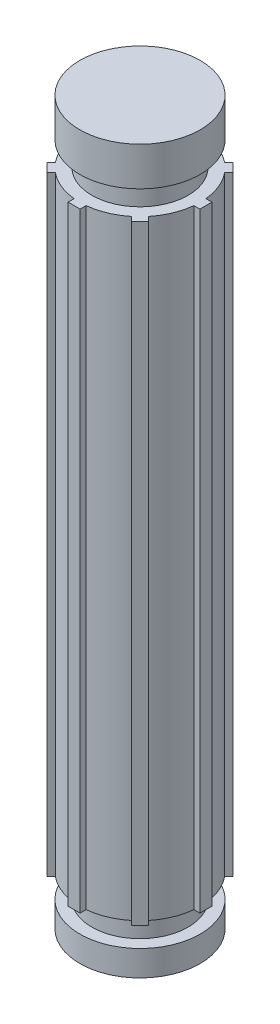
ISO-10303-21;
HEADER;
FILE_DESCRIPTION(('STEP AP214'),'2;1');
FILE_NAME('part.step','',(''),(''),'','','');
FILE_SCHEMA(('AUTOMOTIVE_DESIGN { 1 0 10303 214 1 1 1 1 }'));
ENDSEC;
DATA;
#1=APPLICATION_CONTEXT('core data for automotive mechanical design processes');
#2=APPLICATION_PROTOCOL_DEFINITION('international standard','automotive_design',2000,#1);
#3=PRODUCT_CONTEXT('',#1,'mechanical');
#4=PRODUCT('Part','Part','',(#3));
#5=PRODUCT_RELATED_PRODUCT_CATEGORY('part','',(#4));
#6=PRODUCT_DEFINITION_FORMATION('','',#4);
#7=PRODUCT_DEFINITION_CONTEXT('part definition',#1,'design');
#8=PRODUCT_DEFINITION('design','',#6,#7);
#9=PRODUCT_DEFINITION_SHAPE('','',#8);
#10=(LENGTH_UNIT() NAMED_UNIT(*) SI_UNIT(.MILLI.,.METRE.));
#11=(NAMED_UNIT(*) PLANE_ANGLE_UNIT() SI_UNIT($,.RADIAN.));
#12=(NAMED_UNIT(*) SI_UNIT($,.STERADIAN.) SOLID_ANGLE_UNIT());
#13=UNCERTAINTY_MEASURE_WITH_UNIT(LENGTH_MEASURE(1.E-05),#10,'distance_accuracy_value','');
#14=(GEOMETRIC_REPRESENTATION_CONTEXT(3) GLOBAL_UNCERTAINTY_ASSIGNED_CONTEXT((#13)) GLOBAL_UNIT_ASSIGNED_CONTEXT((#10,
#11,#12)) REPRESENTATION_CONTEXT('',''));
#15=CARTESIAN_POINT('',(0.,0.,0.));
#16=DIRECTION('',(0.,0.,1.));
#17=DIRECTION('',(1.,0.,0.));
#18=AXIS2_PLACEMENT_3D('',#15,#16,#17);
#19=CARTESIAN_POINT('',(0.,0.,0.));
#20=DIRECTION('',(0.,-1.,0.));
#21=DIRECTION('',(0.,0.,-1.));
#22=AXIS2_PLACEMENT_3D('',#19,#20,#21);
#23=CYLINDRICAL_SURFACE('',#22,10.);
#24=CARTESIAN_POINT('',(0.,109.568605078673,0.));
#25=DIRECTION('',(0.,-1.,0.));
#26=DIRECTION('',(0.,0.,-1.));
#27=AXIS2_PLACEMENT_3D('',#24,#25,#26);
#28=CIRCLE('',#27,10.);
#29=CARTESIAN_POINT('',(9.94987437106619,109.568605078673,1.0000000000001));
#30=VERTEX_POINT('',#29);
#31=CARTESIAN_POINT('',(7.74273042092162,109.568605078673,6.32851685854869));
#32=VERTEX_POINT('',#31);
#33=EDGE_CURVE('E558',#30,#32,#28,.T.);
#34=ORIENTED_EDGE('',*,*,#33,.T.);
#35=DIRECTION('',(0.,-1.,0.));
#36=VECTOR('',#35,1.);
#37=CARTESIAN_POINT('',(7.74273042092161,112.568605078673,6.32851685854869));
#38=LINE('',#37,#36);
#39=CARTESIAN_POINT('',(7.74273042092162,8.24351842560416,6.32851685854869));
#40=VERTEX_POINT('',#39);
#41=EDGE_CURVE('E66',#32,#40,#38,.T.);
#42=ORIENTED_EDGE('',*,*,#41,.T.);
#43=CARTESIAN_POINT('',(0.,8.24351842560416,0.));
#44=DIRECTION('',(0.,-1.,0.));
#45=DIRECTION('',(0.,0.,-1.));
#46=AXIS2_PLACEMENT_3D('',#43,#44,#45);
#47=CIRCLE('',#46,10.);
#48=CARTESIAN_POINT('',(9.94987437106619,8.24351842560416,1.0000000000001));
#49=VERTEX_POINT('',#48);
#50=EDGE_CURVE('E277',#49,#40,#47,.T.);
#51=ORIENTED_EDGE('',*,*,#50,.F.);
#52=DIRECTION('',(0.,-1.,0.));
#53=VECTOR('',#52,1.);
#54=CARTESIAN_POINT('',(9.94987437106619,111.804673056173,1.0000000000001));
#55=LINE('',#54,#53);
#56=EDGE_CURVE('E299',#30,#49,#55,.T.);
#57=ORIENTED_EDGE('',*,*,#56,.F.);
#58=EDGE_LOOP('',(#34,#42,#51,#57));
#59=FACE_BOUND('',#58,.T.);
#60=ADVANCED_FACE('F43',(#59),#23,.T.);
#61=CARTESIAN_POINT('',(6.3285168585485,8.24351842560416,7.74273042092177));
#62=VERTEX_POINT('',#61);
#63=CARTESIAN_POINT('',(1.,8.24351842560416,9.9498743710662));
#64=VERTEX_POINT('',#63);
#65=EDGE_CURVE('E58',#62,#64,#47,.T.);
#66=ORIENTED_EDGE('',*,*,#65,.F.);
#67=DIRECTION('',(0.,-1.,0.));
#68=VECTOR('',#67,1.);
#69=CARTESIAN_POINT('',(6.3285168585485,112.568605078673,7.74273042092177));
#70=LINE('',#69,#68);
#71=CARTESIAN_POINT('',(6.3285168585485,109.568605078673,7.74273042092177));
#72=VERTEX_POINT('',#71);
#73=EDGE_CURVE('E272',#72,#62,#70,.T.);
#74=ORIENTED_EDGE('',*,*,#73,.F.);
#75=CARTESIAN_POINT('',(1.,109.568605078673,9.9498743710662));
#76=VERTEX_POINT('',#75);
#77=EDGE_CURVE('E468',#72,#76,#28,.T.);
#78=ORIENTED_EDGE('',*,*,#77,.T.);
#79=DIRECTION('',(0.,-1.,0.));
#80=VECTOR('',#79,1.);
#81=CARTESIAN_POINT('',(1.,111.804673056173,9.9498743710662));
#82=LINE('',#81,#80);
#83=EDGE_CURVE('E460',#76,#64,#82,.T.);
#84=ORIENTED_EDGE('',*,*,#83,.T.);
#85=EDGE_LOOP('',(#66,#74,#78,#84));
#86=FACE_BOUND('',#85,.T.);
#87=ADVANCED_FACE('F519',(#86),#23,.T.);
#88=CARTESIAN_POINT('',(7.74273042092175,109.568605078673,-6.32851685854853));
#89=VERTEX_POINT('',#88);
#90=CARTESIAN_POINT('',(9.94987437106621,109.568605078673,-0.999999999999896));
#91=VERTEX_POINT('',#90);
#92=EDGE_CURVE('E559',#89,#91,#28,.T.);
#93=ORIENTED_EDGE('',*,*,#92,.T.);
#94=DIRECTION('',(0.,-1.,0.));
#95=VECTOR('',#94,1.);
#96=CARTESIAN_POINT('',(9.94987437106621,111.804673056173,-0.999999999999895));
#97=LINE('',#96,#95);
#98=CARTESIAN_POINT('',(9.94987437106621,8.24351842560416,-0.999999999999896));
#99=VERTEX_POINT('',#98);
#100=EDGE_CURVE('E310',#91,#99,#97,.T.);
#101=ORIENTED_EDGE('',*,*,#100,.T.);
#102=CARTESIAN_POINT('',(7.74273042092175,8.24351842560416,-6.32851685854853));
#103=VERTEX_POINT('',#102);
#104=EDGE_CURVE('E593',#103,#99,#47,.T.);
#105=ORIENTED_EDGE('',*,*,#104,.F.);
#106=DIRECTION('',(0.,-1.,0.));
#107=VECTOR('',#106,1.);
#108=CARTESIAN_POINT('',(7.74273042092175,112.568605078673,-6.32851685854853));
#109=LINE('',#108,#107);
#110=EDGE_CURVE('E324',#89,#103,#109,.T.);
#111=ORIENTED_EDGE('',*,*,#110,.F.);
#112=EDGE_LOOP('',(#93,#101,#105,#111));
#113=FACE_BOUND('',#112,.T.);
#114=ADVANCED_FACE('F523',(#113),#23,.T.);
#115=CARTESIAN_POINT('',(1.,109.568605078673,-9.9498743710662));
#116=VERTEX_POINT('',#115);
#117=CARTESIAN_POINT('',(6.32851685854866,109.568605078673,-7.74273042092164));
#118=VERTEX_POINT('',#117);
#119=EDGE_CURVE('E561',#116,#118,#28,.T.);
#120=ORIENTED_EDGE('',*,*,#119,.T.);
#121=DIRECTION('',(0.,-1.,0.));
#122=VECTOR('',#121,1.);
#123=CARTESIAN_POINT('',(6.32851685854866,112.568605078673,-7.74273042092164));
#124=LINE('',#123,#122);
#125=CARTESIAN_POINT('',(6.32851685854866,8.24351842560416,-7.74273042092164));
#126=VERTEX_POINT('',#125);
#127=EDGE_CURVE('E335',#118,#126,#124,.T.);
#128=ORIENTED_EDGE('',*,*,#127,.T.);
#129=CARTESIAN_POINT('',(1.,8.24351842560416,-9.9498743710662));
#130=VERTEX_POINT('',#129);
#131=EDGE_CURVE('E589',#130,#126,#47,.T.);
#132=ORIENTED_EDGE('',*,*,#131,.F.);
#133=DIRECTION('',(0.,-1.,0.));
#134=VECTOR('',#133,1.);
#135=CARTESIAN_POINT('',(1.,111.804673056173,-9.9498743710662));
#136=LINE('',#135,#134);
#137=EDGE_CURVE('E349',#116,#130,#136,.T.);
#138=ORIENTED_EDGE('',*,*,#137,.F.);
#139=EDGE_LOOP('',(#120,#128,#132,#138));
#140=FACE_BOUND('',#139,.T.);
#141=ADVANCED_FACE('F627',(#140),#23,.T.);
#142=CARTESIAN_POINT('',(-6.32851685854856,109.568605078673,-7.74273042092173));
#143=VERTEX_POINT('',#142);
#144=CARTESIAN_POINT('',(-1.,109.568605078673,-9.9498743710662));
#145=VERTEX_POINT('',#144);
#146=EDGE_CURVE('E564',#143,#145,#28,.T.);
#147=ORIENTED_EDGE('',*,*,#146,.T.);
#148=DIRECTION('',(0.,-1.,0.));
#149=VECTOR('',#148,1.);
#150=CARTESIAN_POINT('',(-0.999999999999998,111.804673056173,-9.9498743710662));
#151=LINE('',#150,#149);
#152=CARTESIAN_POINT('',(-1.,8.24351842560416,-9.9498743710662));
#153=VERTEX_POINT('',#152);
#154=EDGE_CURVE('E360',#145,#153,#151,.T.);
#155=ORIENTED_EDGE('',*,*,#154,.T.);
#156=CARTESIAN_POINT('',(-6.32851685854856,8.24351842560416,-7.74273042092172));
#157=VERTEX_POINT('',#156);
#158=EDGE_CURVE('E586',#157,#153,#47,.T.);
#159=ORIENTED_EDGE('',*,*,#158,.F.);
#160=DIRECTION('',(0.,-1.,0.));
#161=VECTOR('',#160,1.);
#162=CARTESIAN_POINT('',(-6.32851685854856,112.568605078673,-7.74273042092173));
#163=LINE('',#162,#161);
#164=EDGE_CURVE('E374',#143,#157,#163,.T.);
#165=ORIENTED_EDGE('',*,*,#164,.F.);
#166=EDGE_LOOP('',(#147,#155,#159,#165));
#167=FACE_BOUND('',#166,.T.);
#168=ADVANCED_FACE('F641',(#167),#23,.T.);
#169=CARTESIAN_POINT('',(-9.9498743710662,109.568605078673,-1.00000000000004));
#170=VERTEX_POINT('',#169);
#171=CARTESIAN_POINT('',(-7.74273042092166,109.568605078673,-6.32851685854864));
#172=VERTEX_POINT('',#171);
#173=EDGE_CURVE('E567',#170,#172,#28,.T.);
#174=ORIENTED_EDGE('',*,*,#173,.T.);
#175=DIRECTION('',(0.,-1.,0.));
#176=VECTOR('',#175,1.);
#177=CARTESIAN_POINT('',(-7.74273042092166,112.568605078673,-6.32851685854864));
#178=LINE('',#177,#176);
#179=CARTESIAN_POINT('',(-7.74273042092166,8.24351842560416,-6.32851685854864));
#180=VERTEX_POINT('',#179);
#181=EDGE_CURVE('E385',#172,#180,#178,.T.);
#182=ORIENTED_EDGE('',*,*,#181,.T.);
#183=CARTESIAN_POINT('',(-9.9498743710662,8.24351842560416,-1.00000000000003));
#184=VERTEX_POINT('',#183);
#185=EDGE_CURVE('E584',#184,#180,#47,.T.);
#186=ORIENTED_EDGE('',*,*,#185,.F.);
#187=DIRECTION('',(0.,-1.,0.));
#188=VECTOR('',#187,1.);
#189=CARTESIAN_POINT('',(-9.9498743710662,111.804673056173,-1.00000000000004));
#190=LINE('',#189,#188);
#191=EDGE_CURVE('E399',#170,#184,#190,.T.);
#192=ORIENTED_EDGE('',*,*,#191,.F.);
#193=EDGE_LOOP('',(#174,#182,#186,#192));
#194=FACE_BOUND('',#193,.T.);
#195=ADVANCED_FACE('F516',(#194),#23,.T.);
#196=CARTESIAN_POINT('',(-7.7427304209217,109.568605078673,6.32851685854858));
#197=VERTEX_POINT('',#196);
#198=CARTESIAN_POINT('',(-9.9498743710662,109.568605078673,0.999999999999965));
#199=VERTEX_POINT('',#198);
#200=EDGE_CURVE('E471',#197,#199,#28,.T.);
#201=ORIENTED_EDGE('',*,*,#200,.T.);
#202=DIRECTION('',(0.,-1.,0.));
#203=VECTOR('',#202,1.);
#204=CARTESIAN_POINT('',(-9.9498743710662,111.804673056173,0.999999999999962));
#205=LINE('',#204,#203);
#206=CARTESIAN_POINT('',(-9.9498743710662,8.24351842560416,0.999999999999965));
#207=VERTEX_POINT('',#206);
#208=EDGE_CURVE('E410',#199,#207,#205,.T.);
#209=ORIENTED_EDGE('',*,*,#208,.T.);
#210=CARTESIAN_POINT('',(-7.7427304209217,8.24351842560416,6.32851685854858));
#211=VERTEX_POINT('',#210);
#212=EDGE_CURVE('E475',#211,#207,#47,.T.);
#213=ORIENTED_EDGE('',*,*,#212,.F.);
#214=DIRECTION('',(0.,-1.,0.));
#215=VECTOR('',#214,1.);
#216=CARTESIAN_POINT('',(-7.7427304209217,112.568605078673,6.32851685854858));
#217=LINE('',#216,#215);
#218=EDGE_CURVE('E424',#197,#211,#217,.T.);
#219=ORIENTED_EDGE('',*,*,#218,.F.);
#220=EDGE_LOOP('',(#201,#209,#213,#219));
#221=FACE_BOUND('',#220,.T.);
#222=ADVANCED_FACE('F500',(#221),#23,.T.);
#223=CARTESIAN_POINT('',(-1.,109.568605078673,9.9498743710662));
#224=VERTEX_POINT('',#223);
#225=CARTESIAN_POINT('',(-6.32851685854861,109.568605078673,7.74273042092168));
#226=VERTEX_POINT('',#225);
#227=EDGE_CURVE('E469',#224,#226,#28,.T.);
#228=ORIENTED_EDGE('',*,*,#227,.T.);
#229=DIRECTION('',(0.,-1.,0.));
#230=VECTOR('',#229,1.);
#231=CARTESIAN_POINT('',(-6.32851685854861,112.568605078673,7.74273042092168));
#232=LINE('',#231,#230);
#233=CARTESIAN_POINT('',(-6.32851685854861,8.24351842560416,7.74273042092168));
#234=VERTEX_POINT('',#233);
#235=EDGE_CURVE('E435',#226,#234,#232,.T.);
#236=ORIENTED_EDGE('',*,*,#235,.T.);
#237=CARTESIAN_POINT('',(-1.,8.24351842560416,9.9498743710662));
#238=VERTEX_POINT('',#237);
#239=EDGE_CURVE('E472',#238,#234,#47,.T.);
#240=ORIENTED_EDGE('',*,*,#239,.F.);
#241=DIRECTION('',(0.,-1.,0.));
#242=VECTOR('',#241,1.);
#243=CARTESIAN_POINT('',(-1.,111.804673056173,9.9498743710662));
#244=LINE('',#243,#242);
#245=EDGE_CURVE('E449',#224,#238,#244,.T.);
#246=ORIENTED_EDGE('',*,*,#245,.F.);
#247=EDGE_LOOP('',(#228,#236,#240,#246));
#248=FACE_BOUND('',#247,.T.);
#249=ADVANCED_FACE('F509',(#248),#23,.T.);
#250=CARTESIAN_POINT('',(0.,0.,0.));
#251=DIRECTION('',(0.,-1.,0.));
#252=DIRECTION('',(0.,0.,-1.));
#253=AXIS2_PLACEMENT_3D('',#250,#251,#252);
#254=CYLINDRICAL_SURFACE('',#253,8.);
#255=CARTESIAN_POINT('',(0.,109.568605078673,0.));
#256=DIRECTION('',(0.,-1.,0.));
#257=DIRECTION('',(0.,0.,-1.));
#258=AXIS2_PLACEMENT_3D('',#255,#256,#257);
#259=CIRCLE('',#258,8.);
#260=CARTESIAN_POINT('',(0.,109.568605078673,-8.));
#261=VERTEX_POINT('',#260);
#262=EDGE_CURVE('E453',#261,#261,#259,.T.);
#263=ORIENTED_EDGE('',*,*,#262,.F.);
#264=EDGE_LOOP('',(#263));
#265=FACE_BOUND('',#264,.T.);
#266=CARTESIAN_POINT('',(0.,113.568605078673,0.));
#267=DIRECTION('',(0.,-1.,0.));
#268=DIRECTION('',(0.,0.,-1.));
#269=AXIS2_PLACEMENT_3D('',#266,#267,#268);
#270=CIRCLE('',#269,8.);
#271=CARTESIAN_POINT('',(0.,113.568605078673,-8.));
#272=VERTEX_POINT('',#271);
#273=EDGE_CURVE('E11',#272,#272,#270,.T.);
#274=ORIENTED_EDGE('',*,*,#273,.T.);
#275=EDGE_LOOP('',(#274));
#276=FACE_BOUND('',#275,.T.);
#277=ADVANCED_FACE('F45',(#265,#276),#254,.T.);
#278=CARTESIAN_POINT('',(0.,113.568605078673,0.));
#279=DIRECTION('',(0.,1.,0.));
#280=DIRECTION('',(0.,0.,1.));
#281=AXIS2_PLACEMENT_3D('',#278,#279,#280);
#282=PLANE('',#281);
#283=ORIENTED_EDGE('',*,*,#273,.F.);
#284=EDGE_LOOP('',(#283));
#285=FACE_BOUND('',#284,.T.);
#286=CARTESIAN_POINT('',(0.,113.568605078673,0.));
#287=DIRECTION('',(0.,-1.,0.));
#288=DIRECTION('',(0.,0.,-1.));
#289=AXIS2_PLACEMENT_3D('',#286,#287,#288);
#290=CIRCLE('',#289,10.);
#291=CARTESIAN_POINT('',(0.,113.568605078673,-10.));
#292=VERTEX_POINT('',#291);
#293=EDGE_CURVE('E51',#292,#292,#290,.T.);
#294=ORIENTED_EDGE('',*,*,#293,.T.);
#295=EDGE_LOOP('',(#294));
#296=FACE_BOUND('',#295,.T.);
#297=ADVANCED_FACE('F492',(#285,#296),#282,.F.);
#298=CARTESIAN_POINT('',(0.,120.,0.));
#299=DIRECTION('',(0.,-1.,0.));
#300=DIRECTION('',(0.,0.,-1.));
#301=AXIS2_PLACEMENT_3D('',#298,#299,#300);
#302=CIRCLE('',#301,10.);
#303=CARTESIAN_POINT('',(0.,120.,-10.));
#304=VERTEX_POINT('',#303);
#305=EDGE_CURVE('E487',#304,#304,#302,.T.);
#306=ORIENTED_EDGE('',*,*,#305,.T.);
#307=EDGE_LOOP('',(#306));
#308=FACE_BOUND('',#307,.T.);
#309=ORIENTED_EDGE('',*,*,#293,.F.);
#310=EDGE_LOOP('',(#309));
#311=FACE_BOUND('',#310,.T.);
#312=ADVANCED_FACE('F494',(#308,#311),#23,.T.);
#313=CARTESIAN_POINT('',(0.,120.,0.));
#314=DIRECTION('',(0.,-1.,0.));
#315=DIRECTION('',(0.,0.,-1.));
#316=AXIS2_PLACEMENT_3D('',#313,#314,#315);
#317=PLANE('',#316);
#318=ORIENTED_EDGE('',*,*,#305,.F.);
#319=EDGE_LOOP('',(#318));
#320=FACE_BOUND('',#319,.T.);
#321=ADVANCED_FACE('F496',(#320),#317,.F.);
#322=CARTESIAN_POINT('',(0.,0.,0.));
#323=DIRECTION('',(0.,-1.,0.));
#324=DIRECTION('',(0.,0.,-1.));
#325=AXIS2_PLACEMENT_3D('',#322,#323,#324);
#326=PLANE('',#325);
#327=CARTESIAN_POINT('',(0.,0.,0.));
#328=DIRECTION('',(0.,-1.,0.));
#329=DIRECTION('',(0.,0.,-1.));
#330=AXIS2_PLACEMENT_3D('',#327,#328,#329);
#331=CIRCLE('',#330,10.);
#332=CARTESIAN_POINT('',(0.,0.,-10.));
#333=VERTEX_POINT('',#332);
#334=EDGE_CURVE('E484',#333,#333,#331,.T.);
#335=ORIENTED_EDGE('',*,*,#334,.T.);
#336=EDGE_LOOP('',(#335));
#337=FACE_BOUND('',#336,.T.);
#338=ADVANCED_FACE('F505',(#337),#326,.T.);
#339=CARTESIAN_POINT('',(0.,4.24351842560416,0.));
#340=DIRECTION('',(0.,-1.,0.));
#341=DIRECTION('',(0.,0.,-1.));
#342=AXIS2_PLACEMENT_3D('',#339,#340,#341);
#343=CIRCLE('',#342,10.);
#344=CARTESIAN_POINT('',(0.,4.24351842560416,-10.));
#345=VERTEX_POINT('',#344);
#346=EDGE_CURVE('E481',#345,#345,#343,.T.);
#347=ORIENTED_EDGE('',*,*,#346,.T.);
#348=EDGE_LOOP('',(#347));
#349=FACE_BOUND('',#348,.T.);
#350=ORIENTED_EDGE('',*,*,#334,.F.);
#351=EDGE_LOOP('',(#350));
#352=FACE_BOUND('',#351,.T.);
#353=ADVANCED_FACE('F499',(#349,#352),#23,.T.);
#354=CARTESIAN_POINT('',(0.,4.24351842560416,0.));
#355=DIRECTION('',(0.,1.,0.));
#356=DIRECTION('',(0.,0.,1.));
#357=AXIS2_PLACEMENT_3D('',#354,#355,#356);
#358=PLANE('',#357);
#359=CARTESIAN_POINT('',(0.,4.24351842560416,0.));
#360=DIRECTION('',(0.,-1.,0.));
#361=DIRECTION('',(0.,0.,-1.));
#362=AXIS2_PLACEMENT_3D('',#359,#360,#361);
#363=CIRCLE('',#362,8.);
#364=CARTESIAN_POINT('',(0.,4.24351842560416,-8.));
#365=VERTEX_POINT('',#364);
#366=EDGE_CURVE('E478',#365,#365,#363,.T.);
#367=ORIENTED_EDGE('',*,*,#366,.T.);
#368=EDGE_LOOP('',(#367));
#369=FACE_BOUND('',#368,.T.);
#370=ORIENTED_EDGE('',*,*,#346,.F.);
#371=EDGE_LOOP('',(#370));
#372=FACE_BOUND('',#371,.T.);
#373=ADVANCED_FACE('F513',(#369,#372),#358,.T.);
#374=CARTESIAN_POINT('',(0.,0.,0.));
#375=DIRECTION('',(0.,-1.,0.));
#376=DIRECTION('',(0.,0.,-1.));
#377=AXIS2_PLACEMENT_3D('',#374,#375,#376);
#378=CYLINDRICAL_SURFACE('',#377,8.);
#379=CARTESIAN_POINT('',(0.,8.24351842560416,0.));
#380=DIRECTION('',(0.,-1.,0.));
#381=DIRECTION('',(0.,0.,-1.));
#382=AXIS2_PLACEMENT_3D('',#379,#380,#381);
#383=CIRCLE('',#382,8.);
#384=CARTESIAN_POINT('',(0.,8.24351842560416,-8.));
#385=VERTEX_POINT('',#384);
#386=EDGE_CURVE('E474',#385,#385,#383,.T.);
#387=ORIENTED_EDGE('',*,*,#386,.T.);
#388=EDGE_LOOP('',(#387));
#389=FACE_BOUND('',#388,.T.);
#390=ORIENTED_EDGE('',*,*,#366,.F.);
#391=EDGE_LOOP('',(#390));
#392=FACE_BOUND('',#391,.T.);
#393=ADVANCED_FACE('F691',(#389,#392),#378,.T.);
#394=CARTESIAN_POINT('',(0.,8.24351842560416,0.));
#395=DIRECTION('',(0.,1.,0.));
#396=DIRECTION('',(0.,0.,1.));
#397=AXIS2_PLACEMENT_3D('',#394,#395,#396);
#398=PLANE('',#397);
#399=ORIENTED_EDGE('',*,*,#386,.F.);
#400=EDGE_LOOP('',(#399));
#401=FACE_BOUND('',#400,.T.);
#402=ORIENTED_EDGE('',*,*,#239,.T.);
#403=DIRECTION('',(0.707106781186549,0.,-0.707106781186546));
#404=VECTOR('',#403,1.);
#405=CARTESIAN_POINT('',(0.707106781186546,8.24351842560416,0.707106781186548));
#406=LINE('',#405,#404);
#407=CARTESIAN_POINT('',(-7.03562363973516,8.24351842560416,8.44983720210823));
#408=VERTEX_POINT('',#407);
#409=EDGE_CURVE('E416',#408,#234,#406,.T.);
#410=ORIENTED_EDGE('',*,*,#409,.F.);
#411=DIRECTION('',(0.707106781186546,0.,0.707106781186549));
#412=VECTOR('',#411,1.);
#413=CARTESIAN_POINT('',(-7.74273042092171,8.24351842560416,7.74273042092168));
#414=LINE('',#413,#412);
#415=CARTESIAN_POINT('',(-8.44983720210825,8.24351842560416,7.03562363973513));
#416=VERTEX_POINT('',#415);
#417=EDGE_CURVE('E421',#416,#408,#414,.T.);
#418=ORIENTED_EDGE('',*,*,#417,.F.);
#419=DIRECTION('',(-0.707106781186549,0.,0.707106781186546));
#420=VECTOR('',#419,1.);
#421=CARTESIAN_POINT('',(-0.707106781186547,8.24351842560416,-0.707106781186549));
#422=LINE('',#421,#420);
#423=EDGE_CURVE('E425',#211,#416,#422,.T.);
#424=ORIENTED_EDGE('',*,*,#423,.F.);
#425=ORIENTED_EDGE('',*,*,#212,.T.);
#426=DIRECTION('',(1.,0.,0.));
#427=VECTOR('',#426,1.);
#428=CARTESIAN_POINT('',(0.,8.24351842560416,1.));
#429=LINE('',#428,#427);
#430=CARTESIAN_POINT('',(-10.9498743710662,8.24351842560416,0.999999999999962));
#431=VERTEX_POINT('',#430);
#432=EDGE_CURVE('E391',#431,#207,#429,.T.);
#433=ORIENTED_EDGE('',*,*,#432,.F.);
#434=DIRECTION('',(0.,0.,1.));
#435=VECTOR('',#434,1.);
#436=CARTESIAN_POINT('',(-10.9498743710662,8.24351842560416,0.));
#437=LINE('',#436,#435);
#438=CARTESIAN_POINT('',(-10.9498743710662,8.24351842560416,-1.00000000000004));
#439=VERTEX_POINT('',#438);
#440=EDGE_CURVE('E396',#439,#431,#437,.T.);
#441=ORIENTED_EDGE('',*,*,#440,.F.);
#442=DIRECTION('',(-1.,0.,0.));
#443=VECTOR('',#442,1.);
#444=CARTESIAN_POINT('',(0.,8.24351842560416,-1.));
#445=LINE('',#444,#443);
#446=EDGE_CURVE('E400',#184,#439,#445,.T.);
#447=ORIENTED_EDGE('',*,*,#446,.F.);
#448=ORIENTED_EDGE('',*,*,#185,.T.);
#449=DIRECTION('',(0.707106781186544,0.,0.707106781186551));
#450=VECTOR('',#449,1.);
#451=CARTESIAN_POINT('',(-0.707106781186552,8.24351842560416,0.707106781186544));
#452=LINE('',#451,#450);
#453=CARTESIAN_POINT('',(-8.4498372021082,8.24351842560416,-7.03562363973519));
#454=VERTEX_POINT('',#453);
#455=EDGE_CURVE('E366',#454,#180,#452,.T.);
#456=ORIENTED_EDGE('',*,*,#455,.F.);
#457=DIRECTION('',(-0.707106781186551,0.,0.707106781186544));
#458=VECTOR('',#457,1.);
#459=CARTESIAN_POINT('',(-7.74273042092165,8.24351842560416,-7.74273042092173));
#460=LINE('',#459,#458);
#461=CARTESIAN_POINT('',(-7.0356236397351,8.24351842560416,-8.44983720210828));
#462=VERTEX_POINT('',#461);
#463=EDGE_CURVE('E371',#462,#454,#460,.T.);
#464=ORIENTED_EDGE('',*,*,#463,.F.);
#465=DIRECTION('',(-0.707106781186544,0.,-0.707106781186551));
#466=VECTOR('',#465,1.);
#467=CARTESIAN_POINT('',(0.707106781186551,8.24351842560416,-0.707106781186543));
#468=LINE('',#467,#466);
#469=EDGE_CURVE('E375',#157,#462,#468,.T.);
#470=ORIENTED_EDGE('',*,*,#469,.F.);
#471=ORIENTED_EDGE('',*,*,#158,.T.);
#472=DIRECTION('',(0.,0.,1.));
#473=VECTOR('',#472,1.);
#474=CARTESIAN_POINT('',(-1.,8.24351842560416,0.));
#475=LINE('',#474,#473);
#476=CARTESIAN_POINT('',(-1.,8.24351842560416,-10.9498743710662));
#477=VERTEX_POINT('',#476);
#478=EDGE_CURVE('E341',#477,#153,#475,.T.);
#479=ORIENTED_EDGE('',*,*,#478,.F.);
#480=DIRECTION('',(-1.,0.,0.));
#481=VECTOR('',#480,1.);
#482=CARTESIAN_POINT('',(0.,8.24351842560416,-10.9498743710662));
#483=LINE('',#482,#481);
#484=CARTESIAN_POINT('',(1.,8.24351842560416,-10.9498743710662));
#485=VERTEX_POINT('',#484);
#486=EDGE_CURVE('E346',#485,#477,#483,.T.);
#487=ORIENTED_EDGE('',*,*,#486,.F.);
#488=DIRECTION('',(0.,0.,-1.));
#489=VECTOR('',#488,1.);
#490=CARTESIAN_POINT('',(1.,8.24351842560416,0.));
#491=LINE('',#490,#489);
#492=EDGE_CURVE('E350',#130,#485,#491,.T.);
#493=ORIENTED_EDGE('',*,*,#492,.F.);
#494=ORIENTED_EDGE('',*,*,#131,.T.);
#495=DIRECTION('',(-0.707106781186554,0.,0.707106781186541));
#496=VECTOR('',#495,1.);
#497=CARTESIAN_POINT('',(-0.707106781186542,8.24351842560416,-0.707106781186554));
#498=LINE('',#497,#496);
#499=CARTESIAN_POINT('',(7.03562363973522,8.24351842560416,-8.44983720210818));
#500=VERTEX_POINT('',#499);
#501=EDGE_CURVE('E316',#500,#126,#498,.T.);
#502=ORIENTED_EDGE('',*,*,#501,.F.);
#503=DIRECTION('',(-0.707106781186541,0.,-0.707106781186554));
#504=VECTOR('',#503,1.);
#505=CARTESIAN_POINT('',(7.74273042092176,8.24351842560416,-7.74273042092162));
#506=LINE('',#505,#504);
#507=CARTESIAN_POINT('',(8.4498372021083,8.24351842560416,-7.03562363973507));
#508=VERTEX_POINT('',#507);
#509=EDGE_CURVE('E321',#508,#500,#506,.T.);
#510=ORIENTED_EDGE('',*,*,#509,.F.);
#511=DIRECTION('',(0.707106781186554,0.,-0.707106781186541));
#512=VECTOR('',#511,1.);
#513=CARTESIAN_POINT('',(0.707106781186541,8.24351842560416,0.707106781186554));
#514=LINE('',#513,#512);
#515=EDGE_CURVE('E325',#103,#508,#514,.T.);
#516=ORIENTED_EDGE('',*,*,#515,.F.);
#517=ORIENTED_EDGE('',*,*,#104,.T.);
#518=DIRECTION('',(-1.,0.,0.));
#519=VECTOR('',#518,1.);
#520=CARTESIAN_POINT('',(0.,8.24351842560416,-1.));
#521=LINE('',#520,#519);
#522=CARTESIAN_POINT('',(10.9498743710662,8.24351842560416,-0.999999999999885));
#523=VERTEX_POINT('',#522);
#524=EDGE_CURVE('E291',#523,#99,#521,.T.);
#525=ORIENTED_EDGE('',*,*,#524,.F.);
#526=DIRECTION('',(0.,0.,-1.));
#527=VECTOR('',#526,1.);
#528=CARTESIAN_POINT('',(10.9498743710662,8.24351842560416,1.14693846087763E-13));
#529=LINE('',#528,#527);
#530=CARTESIAN_POINT('',(10.9498743710662,8.24351842560416,1.00000000000011));
#531=VERTEX_POINT('',#530);
#532=EDGE_CURVE('E296',#531,#523,#529,.T.);
#533=ORIENTED_EDGE('',*,*,#532,.F.);
#534=DIRECTION('',(1.,0.,0.));
#535=VECTOR('',#534,1.);
#536=CARTESIAN_POINT('',(0.,8.24351842560416,1.));
#537=LINE('',#536,#535);
#538=EDGE_CURVE('E300',#49,#531,#537,.T.);
#539=ORIENTED_EDGE('',*,*,#538,.F.);
#540=ORIENTED_EDGE('',*,*,#50,.T.);
#541=DIRECTION('',(-0.707106781186539,0.,-0.707106781186556));
#542=VECTOR('',#541,1.);
#543=CARTESIAN_POINT('',(0.707106781186556,8.24351842560416,-0.707106781186539));
#544=LINE('',#543,#542);
#545=CARTESIAN_POINT('',(8.44983720210815,8.24351842560416,7.03562363973525));
#546=VERTEX_POINT('',#545);
#547=EDGE_CURVE('E258',#546,#40,#544,.T.);
#548=ORIENTED_EDGE('',*,*,#547,.F.);
#549=DIRECTION('',(0.707106781186556,0.,-0.707106781186539));
#550=VECTOR('',#549,1.);
#551=CARTESIAN_POINT('',(7.7427304209216,8.24351842560416,7.74273042092179));
#552=LINE('',#551,#550);
#553=CARTESIAN_POINT('',(7.03562363973504,8.24351842560416,8.44983720210833));
#554=VERTEX_POINT('',#553);
#555=EDGE_CURVE('E265',#554,#546,#552,.T.);
#556=ORIENTED_EDGE('',*,*,#555,.F.);
#557=DIRECTION('',(0.707106781186539,0.,0.707106781186556));
#558=VECTOR('',#557,1.);
#559=CARTESIAN_POINT('',(-0.707106781186556,8.24351842560416,0.707106781186539));
#560=LINE('',#559,#558);
#561=EDGE_CURVE('E281',#62,#554,#560,.T.);
#562=ORIENTED_EDGE('',*,*,#561,.F.);
#563=ORIENTED_EDGE('',*,*,#65,.T.);
#564=DIRECTION('',(0.,0.,-1.));
#565=VECTOR('',#564,1.);
#566=CARTESIAN_POINT('',(1.,8.24351842560416,0.));
#567=LINE('',#566,#565);
#568=CARTESIAN_POINT('',(1.,8.24351842560416,10.9498743710662));
#569=VERTEX_POINT('',#568);
#570=EDGE_CURVE('E441',#569,#64,#567,.T.);
#571=ORIENTED_EDGE('',*,*,#570,.F.);
#572=DIRECTION('',(1.,0.,0.));
#573=VECTOR('',#572,1.);
#574=CARTESIAN_POINT('',(0.,8.24351842560416,10.9498743710662));
#575=LINE('',#574,#573);
#576=CARTESIAN_POINT('',(-1.,8.24351842560416,10.9498743710662));
#577=VERTEX_POINT('',#576);
#578=EDGE_CURVE('E446',#577,#569,#575,.T.);
#579=ORIENTED_EDGE('',*,*,#578,.F.);
#580=DIRECTION('',(0.,0.,1.));
#581=VECTOR('',#580,1.);
#582=CARTESIAN_POINT('',(-1.,8.24351842560416,0.));
#583=LINE('',#582,#581);
#584=EDGE_CURVE('E450',#238,#577,#583,.T.);
#585=ORIENTED_EDGE('',*,*,#584,.F.);
#586=EDGE_LOOP('',(#402,#410,#418,#424,#425,#433,#441,#447,#448,#456,#464,#470,#471,#479,#487,
#493,#494,#502,#510,#516,#517,#525,#533,#539,#540,#548,#556,#562,#563,#571,#579,#585));
#587=FACE_BOUND('',#586,.T.);
#588=ADVANCED_FACE('F275',(#401,#587),#398,.F.);
#589=CARTESIAN_POINT('',(0.,109.568605078673,0.));
#590=DIRECTION('',(0.,1.,0.));
#591=DIRECTION('',(0.,0.,1.));
#592=AXIS2_PLACEMENT_3D('',#589,#590,#591);
#593=PLANE('',#592);
#594=ORIENTED_EDGE('',*,*,#262,.T.);
#595=EDGE_LOOP('',(#594));
#596=FACE_BOUND('',#595,.T.);
#597=ORIENTED_EDGE('',*,*,#227,.F.);
#598=DIRECTION('',(0.,0.,1.));
#599=VECTOR('',#598,1.);
#600=CARTESIAN_POINT('',(-1.,109.568605078673,0.));
#601=LINE('',#600,#599);
#602=CARTESIAN_POINT('',(-1.,109.568605078673,10.9498743710662));
#603=VERTEX_POINT('',#602);
#604=EDGE_CURVE('E428',#224,#603,#601,.T.);
#605=ORIENTED_EDGE('',*,*,#604,.T.);
#606=DIRECTION('',(1.,0.,0.));
#607=VECTOR('',#606,1.);
#608=CARTESIAN_POINT('',(0.,109.568605078673,10.9498743710662));
#609=LINE('',#608,#607);
#610=CARTESIAN_POINT('',(1.,109.568605078673,10.9498743710662));
#611=VERTEX_POINT('',#610);
#612=EDGE_CURVE('E455',#603,#611,#609,.T.);
#613=ORIENTED_EDGE('',*,*,#612,.T.);
#614=DIRECTION('',(0.,0.,-1.));
#615=VECTOR('',#614,1.);
#616=CARTESIAN_POINT('',(1.,109.568605078673,0.));
#617=LINE('',#616,#615);
#618=EDGE_CURVE('E457',#611,#76,#617,.T.);
#619=ORIENTED_EDGE('',*,*,#618,.T.);
#620=ORIENTED_EDGE('',*,*,#77,.F.);
#621=DIRECTION('',(0.707106781186539,0.,0.707106781186556));
#622=VECTOR('',#621,1.);
#623=CARTESIAN_POINT('',(-0.707106781186556,109.568605078673,0.707106781186539));
#624=LINE('',#623,#622);
#625=CARTESIAN_POINT('',(7.03562363973504,109.568605078673,8.44983720210833));
#626=VERTEX_POINT('',#625);
#627=EDGE_CURVE('E284',#72,#626,#624,.T.);
#628=ORIENTED_EDGE('',*,*,#627,.T.);
#629=DIRECTION('',(0.707106781186556,0.,-0.707106781186539));
#630=VECTOR('',#629,1.);
#631=CARTESIAN_POINT('',(7.7427304209216,109.568605078673,7.74273042092179));
#632=LINE('',#631,#630);
#633=CARTESIAN_POINT('',(8.44983720210815,109.568605078673,7.03562363973525));
#634=VERTEX_POINT('',#633);
#635=EDGE_CURVE('E286',#626,#634,#632,.T.);
#636=ORIENTED_EDGE('',*,*,#635,.T.);
#637=DIRECTION('',(-0.707106781186539,0.,-0.707106781186556));
#638=VECTOR('',#637,1.);
#639=CARTESIAN_POINT('',(0.707106781186556,109.568605078673,-0.707106781186539));
#640=LINE('',#639,#638);
#641=EDGE_CURVE('E260',#634,#32,#640,.T.);
#642=ORIENTED_EDGE('',*,*,#641,.T.);
#643=ORIENTED_EDGE('',*,*,#33,.F.);
#644=DIRECTION('',(1.,0.,0.));
#645=VECTOR('',#644,1.);
#646=CARTESIAN_POINT('',(0.,109.568605078673,1.));
#647=LINE('',#646,#645);
#648=CARTESIAN_POINT('',(10.9498743710662,109.568605078673,1.00000000000011));
#649=VERTEX_POINT('',#648);
#650=EDGE_CURVE('E283',#30,#649,#647,.T.);
#651=ORIENTED_EDGE('',*,*,#650,.T.);
#652=DIRECTION('',(0.,0.,-1.));
#653=VECTOR('',#652,1.);
#654=CARTESIAN_POINT('',(10.9498743710662,109.568605078673,1.14693846087763E-13));
#655=LINE('',#654,#653);
#656=CARTESIAN_POINT('',(10.9498743710662,109.568605078673,-0.999999999999885));
#657=VERTEX_POINT('',#656);
#658=EDGE_CURVE('E305',#649,#657,#655,.T.);
#659=ORIENTED_EDGE('',*,*,#658,.T.);
#660=DIRECTION('',(-1.,0.,0.));
#661=VECTOR('',#660,1.);
#662=CARTESIAN_POINT('',(0.,109.568605078673,-1.));
#663=LINE('',#662,#661);
#664=EDGE_CURVE('E307',#657,#91,#663,.T.);
#665=ORIENTED_EDGE('',*,*,#664,.T.);
#666=ORIENTED_EDGE('',*,*,#92,.F.);
#667=DIRECTION('',(0.707106781186554,0.,-0.707106781186541));
#668=VECTOR('',#667,1.);
#669=CARTESIAN_POINT('',(0.707106781186541,109.568605078673,0.707106781186554));
#670=LINE('',#669,#668);
#671=CARTESIAN_POINT('',(8.4498372021083,109.568605078673,-7.03562363973507));
#672=VERTEX_POINT('',#671);
#673=EDGE_CURVE('E303',#89,#672,#670,.T.);
#674=ORIENTED_EDGE('',*,*,#673,.T.);
#675=DIRECTION('',(-0.707106781186541,0.,-0.707106781186554));
#676=VECTOR('',#675,1.);
#677=CARTESIAN_POINT('',(7.74273042092176,109.568605078673,-7.74273042092162));
#678=LINE('',#677,#676);
#679=CARTESIAN_POINT('',(7.03562363973522,109.568605078673,-8.44983720210818));
#680=VERTEX_POINT('',#679);
#681=EDGE_CURVE('E330',#672,#680,#678,.T.);
#682=ORIENTED_EDGE('',*,*,#681,.T.);
#683=DIRECTION('',(-0.707106781186554,0.,0.707106781186541));
#684=VECTOR('',#683,1.);
#685=CARTESIAN_POINT('',(-0.707106781186542,109.568605078673,-0.707106781186554));
#686=LINE('',#685,#684);
#687=EDGE_CURVE('E332',#680,#118,#686,.T.);
#688=ORIENTED_EDGE('',*,*,#687,.T.);
#689=ORIENTED_EDGE('',*,*,#119,.F.);
#690=DIRECTION('',(0.,0.,-1.));
#691=VECTOR('',#690,1.);
#692=CARTESIAN_POINT('',(1.,109.568605078673,0.));
#693=LINE('',#692,#691);
#694=CARTESIAN_POINT('',(1.,109.568605078673,-10.9498743710662));
#695=VERTEX_POINT('',#694);
#696=EDGE_CURVE('E328',#116,#695,#693,.T.);
#697=ORIENTED_EDGE('',*,*,#696,.T.);
#698=DIRECTION('',(-1.,0.,0.));
#699=VECTOR('',#698,1.);
#700=CARTESIAN_POINT('',(0.,109.568605078673,-10.9498743710662));
#701=LINE('',#700,#699);
#702=CARTESIAN_POINT('',(-1.,109.568605078673,-10.9498743710662));
#703=VERTEX_POINT('',#702);
#704=EDGE_CURVE('E355',#695,#703,#701,.T.);
#705=ORIENTED_EDGE('',*,*,#704,.T.);
#706=DIRECTION('',(0.,0.,1.));
#707=VECTOR('',#706,1.);
#708=CARTESIAN_POINT('',(-1.,109.568605078673,0.));
#709=LINE('',#708,#707);
#710=EDGE_CURVE('E357',#703,#145,#709,.T.);
#711=ORIENTED_EDGE('',*,*,#710,.T.);
#712=ORIENTED_EDGE('',*,*,#146,.F.);
#713=DIRECTION('',(-0.707106781186544,0.,-0.707106781186551));
#714=VECTOR('',#713,1.);
#715=CARTESIAN_POINT('',(0.707106781186551,109.568605078673,-0.707106781186543));
#716=LINE('',#715,#714);
#717=CARTESIAN_POINT('',(-7.0356236397351,109.568605078673,-8.44983720210828));
#718=VERTEX_POINT('',#717);
#719=EDGE_CURVE('E353',#143,#718,#716,.T.);
#720=ORIENTED_EDGE('',*,*,#719,.T.);
#721=DIRECTION('',(-0.707106781186551,0.,0.707106781186544));
#722=VECTOR('',#721,1.);
#723=CARTESIAN_POINT('',(-7.74273042092165,109.568605078673,-7.74273042092173));
#724=LINE('',#723,#722);
#725=CARTESIAN_POINT('',(-8.4498372021082,109.568605078673,-7.03562363973519));
#726=VERTEX_POINT('',#725);
#727=EDGE_CURVE('E380',#718,#726,#724,.T.);
#728=ORIENTED_EDGE('',*,*,#727,.T.);
#729=DIRECTION('',(0.707106781186544,0.,0.707106781186551));
#730=VECTOR('',#729,1.);
#731=CARTESIAN_POINT('',(-0.707106781186552,109.568605078673,0.707106781186544));
#732=LINE('',#731,#730);
#733=EDGE_CURVE('E382',#726,#172,#732,.T.);
#734=ORIENTED_EDGE('',*,*,#733,.T.);
#735=ORIENTED_EDGE('',*,*,#173,.F.);
#736=DIRECTION('',(-1.,0.,0.));
#737=VECTOR('',#736,1.);
#738=CARTESIAN_POINT('',(0.,109.568605078673,-1.));
#739=LINE('',#738,#737);
#740=CARTESIAN_POINT('',(-10.9498743710662,109.568605078673,-1.00000000000004));
#741=VERTEX_POINT('',#740);
#742=EDGE_CURVE('E378',#170,#741,#739,.T.);
#743=ORIENTED_EDGE('',*,*,#742,.T.);
#744=DIRECTION('',(0.,0.,1.));
#745=VECTOR('',#744,1.);
#746=CARTESIAN_POINT('',(-10.9498743710662,109.568605078673,0.));
#747=LINE('',#746,#745);
#748=CARTESIAN_POINT('',(-10.9498743710662,109.568605078673,0.999999999999962));
#749=VERTEX_POINT('',#748);
#750=EDGE_CURVE('E405',#741,#749,#747,.T.);
#751=ORIENTED_EDGE('',*,*,#750,.T.);
#752=DIRECTION('',(1.,0.,0.));
#753=VECTOR('',#752,1.);
#754=CARTESIAN_POINT('',(0.,109.568605078673,1.));
#755=LINE('',#754,#753);
#756=EDGE_CURVE('E407',#749,#199,#755,.T.);
#757=ORIENTED_EDGE('',*,*,#756,.T.);
#758=ORIENTED_EDGE('',*,*,#200,.F.);
#759=DIRECTION('',(-0.707106781186549,0.,0.707106781186546));
#760=VECTOR('',#759,1.);
#761=CARTESIAN_POINT('',(-0.707106781186547,109.568605078673,-0.707106781186549));
#762=LINE('',#761,#760);
#763=CARTESIAN_POINT('',(-8.44983720210825,109.568605078673,7.03562363973513));
#764=VERTEX_POINT('',#763);
#765=EDGE_CURVE('E403',#197,#764,#762,.T.);
#766=ORIENTED_EDGE('',*,*,#765,.T.);
#767=DIRECTION('',(0.707106781186546,0.,0.707106781186549));
#768=VECTOR('',#767,1.);
#769=CARTESIAN_POINT('',(-7.74273042092171,109.568605078673,7.74273042092168));
#770=LINE('',#769,#768);
#771=CARTESIAN_POINT('',(-7.03562363973516,109.568605078673,8.44983720210823));
#772=VERTEX_POINT('',#771);
#773=EDGE_CURVE('E430',#764,#772,#770,.T.);
#774=ORIENTED_EDGE('',*,*,#773,.T.);
#775=DIRECTION('',(0.707106781186549,0.,-0.707106781186546));
#776=VECTOR('',#775,1.);
#777=CARTESIAN_POINT('',(0.707106781186546,109.568605078673,0.707106781186548));
#778=LINE('',#777,#776);
#779=EDGE_CURVE('E432',#772,#226,#778,.T.);
#780=ORIENTED_EDGE('',*,*,#779,.T.);
#781=EDGE_LOOP('',(#597,#605,#613,#619,#620,#628,#636,#642,#643,#651,#659,#665,#666,#674,#682,
#688,#689,#697,#705,#711,#712,#720,#728,#734,#735,#743,#751,#757,#758,#766,#774,#780));
#782=FACE_BOUND('',#781,.T.);
#783=ADVANCED_FACE('F535',(#596,#782),#593,.T.);
#784=CARTESIAN_POINT('',(1.,111.804673056173,0.));
#785=DIRECTION('',(-1.,0.,0.));
#786=DIRECTION('',(0.,0.,1.));
#787=AXIS2_PLACEMENT_3D('',#784,#785,#786);
#788=PLANE('',#787);
#789=ORIENTED_EDGE('',*,*,#618,.F.);
#790=DIRECTION('',(0.,-1.,0.));
#791=VECTOR('',#790,1.);
#792=CARTESIAN_POINT('',(1.,111.804673056173,10.9498743710662));
#793=LINE('',#792,#791);
#794=EDGE_CURVE('E445',#611,#569,#793,.T.);
#795=ORIENTED_EDGE('',*,*,#794,.T.);
#796=ORIENTED_EDGE('',*,*,#570,.T.);
#797=ORIENTED_EDGE('',*,*,#83,.F.);
#798=EDGE_LOOP('',(#789,#795,#796,#797));
#799=FACE_BOUND('',#798,.T.);
#800=ADVANCED_FACE('F556',(#799),#788,.F.);
#801=CARTESIAN_POINT('',(0.,111.804673056173,10.9498743710662));
#802=DIRECTION('',(0.,0.,-1.));
#803=DIRECTION('',(-1.,0.,0.));
#804=AXIS2_PLACEMENT_3D('',#801,#802,#803);
#805=PLANE('',#804);
#806=ORIENTED_EDGE('',*,*,#612,.F.);
#807=DIRECTION('',(0.,-1.,0.));
#808=VECTOR('',#807,1.);
#809=CARTESIAN_POINT('',(-1.,111.804673056173,10.9498743710662));
#810=LINE('',#809,#808);
#811=EDGE_CURVE('E444',#603,#577,#810,.T.);
#812=ORIENTED_EDGE('',*,*,#811,.T.);
#813=ORIENTED_EDGE('',*,*,#578,.T.);
#814=ORIENTED_EDGE('',*,*,#794,.F.);
#815=EDGE_LOOP('',(#806,#812,#813,#814));
#816=FACE_BOUND('',#815,.T.);
#817=ADVANCED_FACE('F553',(#816),#805,.F.);
#818=CARTESIAN_POINT('',(-1.,111.804673056173,0.));
#819=DIRECTION('',(1.,0.,0.));
#820=DIRECTION('',(0.,0.,-1.));
#821=AXIS2_PLACEMENT_3D('',#818,#819,#820);
#822=PLANE('',#821);
#823=ORIENTED_EDGE('',*,*,#604,.F.);
#824=ORIENTED_EDGE('',*,*,#245,.T.);
#825=ORIENTED_EDGE('',*,*,#584,.T.);
#826=ORIENTED_EDGE('',*,*,#811,.F.);
#827=EDGE_LOOP('',(#823,#824,#825,#826));
#828=FACE_BOUND('',#827,.T.);
#829=ADVANCED_FACE('F546',(#828),#822,.F.);
#830=CARTESIAN_POINT('',(0.707106781186546,112.568605078673,0.707106781186548));
#831=DIRECTION('',(-0.707106781186546,0.,-0.707106781186549));
#832=DIRECTION('',(-0.707106781186549,0.,0.707106781186546));
#833=AXIS2_PLACEMENT_3D('',#830,#831,#832);
#834=PLANE('',#833);
#835=ORIENTED_EDGE('',*,*,#779,.F.);
#836=DIRECTION('',(0.,-1.,0.));
#837=VECTOR('',#836,1.);
#838=CARTESIAN_POINT('',(-7.03562363973516,112.568605078673,8.44983720210823));
#839=LINE('',#838,#837);
#840=EDGE_CURVE('E420',#772,#408,#839,.T.);
#841=ORIENTED_EDGE('',*,*,#840,.T.);
#842=ORIENTED_EDGE('',*,*,#409,.T.);
#843=ORIENTED_EDGE('',*,*,#235,.F.);
#844=EDGE_LOOP('',(#835,#841,#842,#843));
#845=FACE_BOUND('',#844,.T.);
#846=ADVANCED_FACE('F539',(#845),#834,.F.);
#847=CARTESIAN_POINT('',(-7.74273042092171,112.568605078673,7.74273042092168));
#848=DIRECTION('',(0.707106781186549,0.,-0.707106781186546));
#849=DIRECTION('',(-0.707106781186546,0.,-0.707106781186549));
#850=AXIS2_PLACEMENT_3D('',#847,#848,#849);
#851=PLANE('',#850);
#852=ORIENTED_EDGE('',*,*,#773,.F.);
#853=DIRECTION('',(0.,-1.,0.));
#854=VECTOR('',#853,1.);
#855=CARTESIAN_POINT('',(-8.44983720210825,112.568605078673,7.03562363973513));
#856=LINE('',#855,#854);
#857=EDGE_CURVE('E419',#764,#416,#856,.T.);
#858=ORIENTED_EDGE('',*,*,#857,.T.);
#859=ORIENTED_EDGE('',*,*,#417,.T.);
#860=ORIENTED_EDGE('',*,*,#840,.F.);
#861=EDGE_LOOP('',(#852,#858,#859,#860));
#862=FACE_BOUND('',#861,.T.);
#863=ADVANCED_FACE('F674',(#862),#851,.F.);
#864=CARTESIAN_POINT('',(-0.707106781186547,112.568605078673,-0.707106781186549));
#865=DIRECTION('',(0.707106781186546,0.,0.707106781186549));
#866=DIRECTION('',(0.707106781186549,0.,-0.707106781186546));
#867=AXIS2_PLACEMENT_3D('',#864,#865,#866);
#868=PLANE('',#867);
#869=ORIENTED_EDGE('',*,*,#765,.F.);
#870=ORIENTED_EDGE('',*,*,#218,.T.);
#871=ORIENTED_EDGE('',*,*,#423,.T.);
#872=ORIENTED_EDGE('',*,*,#857,.F.);
#873=EDGE_LOOP('',(#869,#870,#871,#872));
#874=FACE_BOUND('',#873,.T.);
#875=ADVANCED_FACE('F668',(#874),#868,.F.);
#876=CARTESIAN_POINT('',(0.,111.804673056173,1.));
#877=DIRECTION('',(0.,0.,-1.));
#878=DIRECTION('',(-1.,0.,0.));
#879=AXIS2_PLACEMENT_3D('',#876,#877,#878);
#880=PLANE('',#879);
#881=ORIENTED_EDGE('',*,*,#756,.F.);
#882=DIRECTION('',(0.,-1.,0.));
#883=VECTOR('',#882,1.);
#884=CARTESIAN_POINT('',(-10.9498743710662,111.804673056173,0.999999999999962));
#885=LINE('',#884,#883);
#886=EDGE_CURVE('E395',#749,#431,#885,.T.);
#887=ORIENTED_EDGE('',*,*,#886,.T.);
#888=ORIENTED_EDGE('',*,*,#432,.T.);
#889=ORIENTED_EDGE('',*,*,#208,.F.);
#890=EDGE_LOOP('',(#881,#887,#888,#889));
#891=FACE_BOUND('',#890,.T.);
#892=ADVANCED_FACE('F580',(#891),#880,.F.);
#893=CARTESIAN_POINT('',(-10.9498743710662,111.804673056173,0.));
#894=DIRECTION('',(1.,0.,0.));
#895=DIRECTION('',(0.,0.,-1.));
#896=AXIS2_PLACEMENT_3D('',#893,#894,#895);
#897=PLANE('',#896);
#898=ORIENTED_EDGE('',*,*,#750,.F.);
#899=DIRECTION('',(0.,-1.,0.));
#900=VECTOR('',#899,1.);
#901=CARTESIAN_POINT('',(-10.9498743710662,111.804673056173,-1.00000000000004));
#902=LINE('',#901,#900);
#903=EDGE_CURVE('E394',#741,#439,#902,.T.);
#904=ORIENTED_EDGE('',*,*,#903,.T.);
#905=ORIENTED_EDGE('',*,*,#440,.T.);
#906=ORIENTED_EDGE('',*,*,#886,.F.);
#907=EDGE_LOOP('',(#898,#904,#905,#906));
#908=FACE_BOUND('',#907,.T.);
#909=ADVANCED_FACE('F660',(#908),#897,.F.);
#910=CARTESIAN_POINT('',(0.,111.804673056173,-1.));
#911=DIRECTION('',(0.,0.,1.));
#912=DIRECTION('',(1.,0.,0.));
#913=AXIS2_PLACEMENT_3D('',#910,#911,#912);
#914=PLANE('',#913);
#915=ORIENTED_EDGE('',*,*,#742,.F.);
#916=ORIENTED_EDGE('',*,*,#191,.T.);
#917=ORIENTED_EDGE('',*,*,#446,.T.);
#918=ORIENTED_EDGE('',*,*,#903,.F.);
#919=EDGE_LOOP('',(#915,#916,#917,#918));
#920=FACE_BOUND('',#919,.T.);
#921=ADVANCED_FACE('F657',(#920),#914,.F.);
#922=CARTESIAN_POINT('',(-0.707106781186552,112.568605078673,0.707106781186544));
#923=DIRECTION('',(0.707106781186551,0.,-0.707106781186544));
#924=DIRECTION('',(-0.707106781186544,0.,-0.707106781186551));
#925=AXIS2_PLACEMENT_3D('',#922,#923,#924);
#926=PLANE('',#925);
#927=ORIENTED_EDGE('',*,*,#733,.F.);
#928=DIRECTION('',(0.,-1.,0.));
#929=VECTOR('',#928,1.);
#930=CARTESIAN_POINT('',(-8.4498372021082,112.568605078673,-7.03562363973519));
#931=LINE('',#930,#929);
#932=EDGE_CURVE('E370',#726,#454,#931,.T.);
#933=ORIENTED_EDGE('',*,*,#932,.T.);
#934=ORIENTED_EDGE('',*,*,#455,.T.);
#935=ORIENTED_EDGE('',*,*,#181,.F.);
#936=EDGE_LOOP('',(#927,#933,#934,#935));
#937=FACE_BOUND('',#936,.T.);
#938=ADVANCED_FACE('F654',(#937),#926,.F.);
#939=CARTESIAN_POINT('',(-7.74273042092165,112.568605078673,-7.74273042092173));
#940=DIRECTION('',(0.707106781186544,0.,0.707106781186551));
#941=DIRECTION('',(0.707106781186551,0.,-0.707106781186544));
#942=AXIS2_PLACEMENT_3D('',#939,#940,#941);
#943=PLANE('',#942);
#944=ORIENTED_EDGE('',*,*,#727,.F.);
#945=DIRECTION('',(0.,-1.,0.));
#946=VECTOR('',#945,1.);
#947=CARTESIAN_POINT('',(-7.0356236397351,112.568605078673,-8.44983720210828));
#948=LINE('',#947,#946);
#949=EDGE_CURVE('E369',#718,#462,#948,.T.);
#950=ORIENTED_EDGE('',*,*,#949,.T.);
#951=ORIENTED_EDGE('',*,*,#463,.T.);
#952=ORIENTED_EDGE('',*,*,#932,.F.);
#953=EDGE_LOOP('',(#944,#950,#951,#952));
#954=FACE_BOUND('',#953,.T.);
#955=ADVANCED_FACE('F650',(#954),#943,.F.);
#956=CARTESIAN_POINT('',(0.707106781186551,112.568605078673,-0.707106781186543));
#957=DIRECTION('',(-0.707106781186551,0.,0.707106781186544));
#958=DIRECTION('',(0.707106781186544,0.,0.707106781186551));
#959=AXIS2_PLACEMENT_3D('',#956,#957,#958);
#960=PLANE('',#959);
#961=ORIENTED_EDGE('',*,*,#719,.F.);
#962=ORIENTED_EDGE('',*,*,#164,.T.);
#963=ORIENTED_EDGE('',*,*,#469,.T.);
#964=ORIENTED_EDGE('',*,*,#949,.F.);
#965=EDGE_LOOP('',(#961,#962,#963,#964));
#966=FACE_BOUND('',#965,.T.);
#967=ADVANCED_FACE('F644',(#966),#960,.F.);
#968=CARTESIAN_POINT('',(-1.,111.804673056173,0.));
#969=DIRECTION('',(1.,0.,0.));
#970=DIRECTION('',(0.,0.,-1.));
#971=AXIS2_PLACEMENT_3D('',#968,#969,#970);
#972=PLANE('',#971);
#973=ORIENTED_EDGE('',*,*,#710,.F.);
#974=DIRECTION('',(0.,-1.,0.));
#975=VECTOR('',#974,1.);
#976=CARTESIAN_POINT('',(-1.,111.804673056173,-10.9498743710662));
#977=LINE('',#976,#975);
#978=EDGE_CURVE('E345',#703,#477,#977,.T.);
#979=ORIENTED_EDGE('',*,*,#978,.T.);
#980=ORIENTED_EDGE('',*,*,#478,.T.);
#981=ORIENTED_EDGE('',*,*,#154,.F.);
#982=EDGE_LOOP('',(#973,#979,#980,#981));
#983=FACE_BOUND('',#982,.T.);
#984=ADVANCED_FACE('F640',(#983),#972,.F.);
#985=CARTESIAN_POINT('',(0.,111.804673056173,-10.9498743710662));
#986=DIRECTION('',(0.,0.,1.));
#987=DIRECTION('',(1.,0.,0.));
#988=AXIS2_PLACEMENT_3D('',#985,#986,#987);
#989=PLANE('',#988);
#990=ORIENTED_EDGE('',*,*,#704,.F.);
#991=DIRECTION('',(0.,-1.,0.));
#992=VECTOR('',#991,1.);
#993=CARTESIAN_POINT('',(1.,111.804673056173,-10.9498743710662));
#994=LINE('',#993,#992);
#995=EDGE_CURVE('E344',#695,#485,#994,.T.);
#996=ORIENTED_EDGE('',*,*,#995,.T.);
#997=ORIENTED_EDGE('',*,*,#486,.T.);
#998=ORIENTED_EDGE('',*,*,#978,.F.);
#999=EDGE_LOOP('',(#990,#996,#997,#998));
#1000=FACE_BOUND('',#999,.T.);
#1001=ADVANCED_FACE('F636',(#1000),#989,.F.);
#1002=CARTESIAN_POINT('',(1.,111.804673056173,0.));
#1003=DIRECTION('',(-1.,0.,0.));
#1004=DIRECTION('',(0.,0.,1.));
#1005=AXIS2_PLACEMENT_3D('',#1002,#1003,#1004);
#1006=PLANE('',#1005);
#1007=ORIENTED_EDGE('',*,*,#696,.F.);
#1008=ORIENTED_EDGE('',*,*,#137,.T.);
#1009=ORIENTED_EDGE('',*,*,#492,.T.);
#1010=ORIENTED_EDGE('',*,*,#995,.F.);
#1011=EDGE_LOOP('',(#1007,#1008,#1009,#1010));
#1012=FACE_BOUND('',#1011,.T.);
#1013=ADVANCED_FACE('F630',(#1012),#1006,.F.);
#1014=CARTESIAN_POINT('',(-0.707106781186542,112.568605078673,-0.707106781186554));
#1015=DIRECTION('',(0.707106781186541,0.,0.707106781186554));
#1016=DIRECTION('',(0.707106781186554,0.,-0.707106781186541));
#1017=AXIS2_PLACEMENT_3D('',#1014,#1015,#1016);
#1018=PLANE('',#1017);
#1019=ORIENTED_EDGE('',*,*,#687,.F.);
#1020=DIRECTION('',(0.,-1.,0.));
#1021=VECTOR('',#1020,1.);
#1022=CARTESIAN_POINT('',(7.03562363973522,112.568605078673,-8.44983720210818));
#1023=LINE('',#1022,#1021);
#1024=EDGE_CURVE('E320',#680,#500,#1023,.T.);
#1025=ORIENTED_EDGE('',*,*,#1024,.T.);
#1026=ORIENTED_EDGE('',*,*,#501,.T.);
#1027=ORIENTED_EDGE('',*,*,#127,.F.);
#1028=EDGE_LOOP('',(#1019,#1025,#1026,#1027));
#1029=FACE_BOUND('',#1028,.T.);
#1030=ADVANCED_FACE('F626',(#1029),#1018,.F.);
#1031=CARTESIAN_POINT('',(7.74273042092176,112.568605078673,-7.74273042092162));
#1032=DIRECTION('',(-0.707106781186554,0.,0.707106781186541));
#1033=DIRECTION('',(0.707106781186541,0.,0.707106781186554));
#1034=AXIS2_PLACEMENT_3D('',#1031,#1032,#1033);
#1035=PLANE('',#1034);
#1036=ORIENTED_EDGE('',*,*,#681,.F.);
#1037=DIRECTION('',(0.,-1.,0.));
#1038=VECTOR('',#1037,1.);
#1039=CARTESIAN_POINT('',(8.4498372021083,112.568605078673,-7.03562363973507));
#1040=LINE('',#1039,#1038);
#1041=EDGE_CURVE('E319',#672,#508,#1040,.T.);
#1042=ORIENTED_EDGE('',*,*,#1041,.T.);
#1043=ORIENTED_EDGE('',*,*,#509,.T.);
#1044=ORIENTED_EDGE('',*,*,#1024,.F.);
#1045=EDGE_LOOP('',(#1036,#1042,#1043,#1044));
#1046=FACE_BOUND('',#1045,.T.);
#1047=ADVANCED_FACE('F622',(#1046),#1035,.F.);
#1048=CARTESIAN_POINT('',(0.707106781186541,112.568605078673,0.707106781186554));
#1049=DIRECTION('',(-0.707106781186541,0.,-0.707106781186554));
#1050=DIRECTION('',(-0.707106781186554,0.,0.707106781186541));
#1051=AXIS2_PLACEMENT_3D('',#1048,#1049,#1050);
#1052=PLANE('',#1051);
#1053=ORIENTED_EDGE('',*,*,#673,.F.);
#1054=ORIENTED_EDGE('',*,*,#110,.T.);
#1055=ORIENTED_EDGE('',*,*,#515,.T.);
#1056=ORIENTED_EDGE('',*,*,#1041,.F.);
#1057=EDGE_LOOP('',(#1053,#1054,#1055,#1056));
#1058=FACE_BOUND('',#1057,.T.);
#1059=ADVANCED_FACE('F616',(#1058),#1052,.F.);
#1060=CARTESIAN_POINT('',(0.,111.804673056173,-1.));
#1061=DIRECTION('',(0.,0.,1.));
#1062=DIRECTION('',(1.,0.,0.));
#1063=AXIS2_PLACEMENT_3D('',#1060,#1061,#1062);
#1064=PLANE('',#1063);
#1065=ORIENTED_EDGE('',*,*,#664,.F.);
#1066=DIRECTION('',(0.,-1.,0.));
#1067=VECTOR('',#1066,1.);
#1068=CARTESIAN_POINT('',(10.9498743710662,111.804673056173,-0.999999999999885));
#1069=LINE('',#1068,#1067);
#1070=EDGE_CURVE('E295',#657,#523,#1069,.T.);
#1071=ORIENTED_EDGE('',*,*,#1070,.T.);
#1072=ORIENTED_EDGE('',*,*,#524,.T.);
#1073=ORIENTED_EDGE('',*,*,#100,.F.);
#1074=EDGE_LOOP('',(#1065,#1071,#1072,#1073));
#1075=FACE_BOUND('',#1074,.T.);
#1076=ADVANCED_FACE('F613',(#1075),#1064,.F.);
#1077=CARTESIAN_POINT('',(10.9498743710662,111.804673056173,1.14693846087763E-13));
#1078=DIRECTION('',(-1.,0.,0.));
#1079=DIRECTION('',(0.,0.,1.));
#1080=AXIS2_PLACEMENT_3D('',#1077,#1078,#1079);
#1081=PLANE('',#1080);
#1082=ORIENTED_EDGE('',*,*,#658,.F.);
#1083=DIRECTION('',(0.,-1.,0.));
#1084=VECTOR('',#1083,1.);
#1085=CARTESIAN_POINT('',(10.9498743710662,111.804673056173,1.00000000000011));
#1086=LINE('',#1085,#1084);
#1087=EDGE_CURVE('E294',#649,#531,#1086,.T.);
#1088=ORIENTED_EDGE('',*,*,#1087,.T.);
#1089=ORIENTED_EDGE('',*,*,#532,.T.);
#1090=ORIENTED_EDGE('',*,*,#1070,.F.);
#1091=EDGE_LOOP('',(#1082,#1088,#1089,#1090));
#1092=FACE_BOUND('',#1091,.T.);
#1093=ADVANCED_FACE('F609',(#1092),#1081,.F.);
#1094=CARTESIAN_POINT('',(0.,111.804673056173,1.));
#1095=DIRECTION('',(0.,0.,-1.));
#1096=DIRECTION('',(-1.,0.,0.));
#1097=AXIS2_PLACEMENT_3D('',#1094,#1095,#1096);
#1098=PLANE('',#1097);
#1099=ORIENTED_EDGE('',*,*,#650,.F.);
#1100=ORIENTED_EDGE('',*,*,#56,.T.);
#1101=ORIENTED_EDGE('',*,*,#538,.T.);
#1102=ORIENTED_EDGE('',*,*,#1087,.F.);
#1103=EDGE_LOOP('',(#1099,#1100,#1101,#1102));
#1104=FACE_BOUND('',#1103,.T.);
#1105=ADVANCED_FACE('F604',(#1104),#1098,.F.);
#1106=CARTESIAN_POINT('',(0.707106781186556,112.568605078673,-0.707106781186539));
#1107=DIRECTION('',(-0.707106781186556,0.,0.707106781186539));
#1108=DIRECTION('',(0.707106781186539,0.,0.707106781186556));
#1109=AXIS2_PLACEMENT_3D('',#1106,#1107,#1108);
#1110=PLANE('',#1109);
#1111=ORIENTED_EDGE('',*,*,#641,.F.);
#1112=DIRECTION('',(0.,-1.,0.));
#1113=VECTOR('',#1112,1.);
#1114=CARTESIAN_POINT('',(8.44983720210815,112.568605078673,7.03562363973525));
#1115=LINE('',#1114,#1113);
#1116=EDGE_CURVE('E254',#634,#546,#1115,.T.);
#1117=ORIENTED_EDGE('',*,*,#1116,.T.);
#1118=ORIENTED_EDGE('',*,*,#547,.T.);
#1119=ORIENTED_EDGE('',*,*,#41,.F.);
#1120=EDGE_LOOP('',(#1111,#1117,#1118,#1119));
#1121=FACE_BOUND('',#1120,.T.);
#1122=ADVANCED_FACE('F256',(#1121),#1110,.F.);
#1123=CARTESIAN_POINT('',(7.7427304209216,112.568605078673,7.74273042092179));
#1124=DIRECTION('',(-0.707106781186539,0.,-0.707106781186556));
#1125=DIRECTION('',(-0.707106781186556,0.,0.707106781186539));
#1126=AXIS2_PLACEMENT_3D('',#1123,#1124,#1125);
#1127=PLANE('',#1126);
#1128=ORIENTED_EDGE('',*,*,#635,.F.);
#1129=DIRECTION('',(0.,-1.,0.));
#1130=VECTOR('',#1129,1.);
#1131=CARTESIAN_POINT('',(7.03562363973504,112.568605078673,8.44983720210833));
#1132=LINE('',#1131,#1130);
#1133=EDGE_CURVE('E268',#626,#554,#1132,.T.);
#1134=ORIENTED_EDGE('',*,*,#1133,.T.);
#1135=ORIENTED_EDGE('',*,*,#555,.T.);
#1136=ORIENTED_EDGE('',*,*,#1116,.F.);
#1137=EDGE_LOOP('',(#1128,#1134,#1135,#1136));
#1138=FACE_BOUND('',#1137,.T.);
#1139=ADVANCED_FACE('F266',(#1138),#1127,.F.);
#1140=CARTESIAN_POINT('',(-0.707106781186556,112.568605078673,0.707106781186539));
#1141=DIRECTION('',(0.707106781186556,0.,-0.707106781186539));
#1142=DIRECTION('',(-0.707106781186539,0.,-0.707106781186556));
#1143=AXIS2_PLACEMENT_3D('',#1140,#1141,#1142);
#1144=PLANE('',#1143);
#1145=ORIENTED_EDGE('',*,*,#627,.F.);
#1146=ORIENTED_EDGE('',*,*,#73,.T.);
#1147=ORIENTED_EDGE('',*,*,#561,.T.);
#1148=ORIENTED_EDGE('',*,*,#1133,.F.);
#1149=EDGE_LOOP('',(#1145,#1146,#1147,#1148));
#1150=FACE_BOUND('',#1149,.T.);
#1151=ADVANCED_FACE('F600',(#1150),#1144,.F.);
#1152=CLOSED_SHELL('',(#60,#87,#114,#141,#168,#195,#222,#249,#277,#297,#312,#321,#338,#353,#373,
#393,#588,#783,#800,#817,#829,#846,#863,#875,#892,#909,#921,#938,#955,#967,#984,#1001,#1013,
#1030,#1047,#1059,#1076,#1093,#1105,#1122,#1139,#1151));
#1153=MANIFOLD_SOLID_BREP('B2',#1152);
#1154=ADVANCED_BREP_SHAPE_REPRESENTATION('',(#18,#1153),#14);
#1155=SHAPE_DEFINITION_REPRESENTATION(#9,#1154);
ENDSEC;
END-ISO-10303-21;
